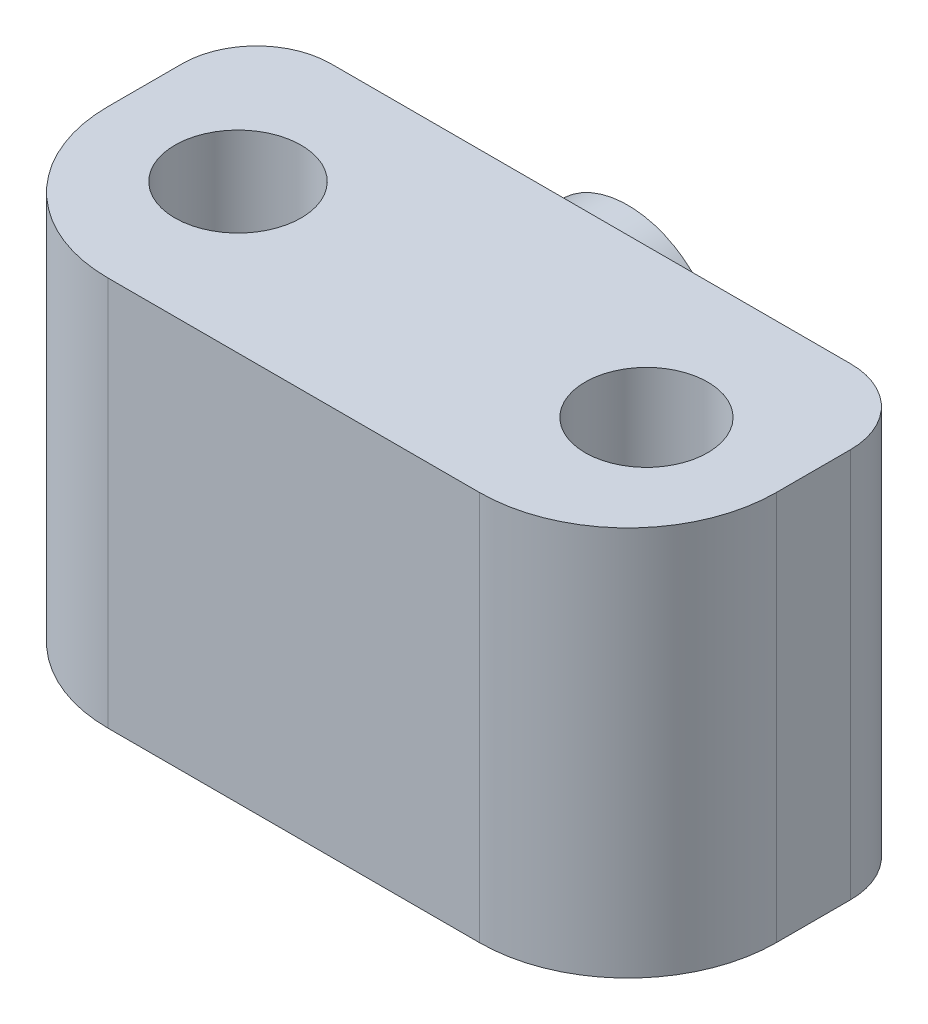
ISO-10303-21;
HEADER;
FILE_DESCRIPTION(('STEP AP214'),'2;1');
FILE_NAME('part.step','',(''),(''),'','','');
FILE_SCHEMA(('AUTOMOTIVE_DESIGN { 1 0 10303 214 1 1 1 1 }'));
ENDSEC;
DATA;
#1=APPLICATION_CONTEXT('core data for automotive mechanical design processes');
#2=APPLICATION_PROTOCOL_DEFINITION('international standard','automotive_design',2000,#1);
#3=PRODUCT_CONTEXT('',#1,'mechanical');
#4=PRODUCT('Part','Part','',(#3));
#5=PRODUCT_RELATED_PRODUCT_CATEGORY('part','',(#4));
#6=PRODUCT_DEFINITION_FORMATION('','',#4);
#7=PRODUCT_DEFINITION_CONTEXT('part definition',#1,'design');
#8=PRODUCT_DEFINITION('design','',#6,#7);
#9=PRODUCT_DEFINITION_SHAPE('','',#8);
#10=(LENGTH_UNIT() NAMED_UNIT(*) SI_UNIT(.MILLI.,.METRE.));
#11=(NAMED_UNIT(*) PLANE_ANGLE_UNIT() SI_UNIT($,.RADIAN.));
#12=(NAMED_UNIT(*) SI_UNIT($,.STERADIAN.) SOLID_ANGLE_UNIT());
#13=UNCERTAINTY_MEASURE_WITH_UNIT(LENGTH_MEASURE(1.E-05),#10,'distance_accuracy_value','');
#14=(GEOMETRIC_REPRESENTATION_CONTEXT(3) GLOBAL_UNCERTAINTY_ASSIGNED_CONTEXT((#13)) GLOBAL_UNIT_ASSIGNED_CONTEXT((#10,
#11,#12)) REPRESENTATION_CONTEXT('',''));
#15=CARTESIAN_POINT('',(0.,0.,0.));
#16=DIRECTION('',(0.,0.,1.));
#17=DIRECTION('',(1.,0.,0.));
#18=AXIS2_PLACEMENT_3D('',#15,#16,#17);
#19=CARTESIAN_POINT('',(-5.5,-18.75,4.));
#20=DIRECTION('',(0.,1.,0.));
#21=DIRECTION('',(0.,0.,1.));
#22=AXIS2_PLACEMENT_3D('',#19,#20,#21);
#23=CYLINDRICAL_SURFACE('',#22,1.25);
#24=CARTESIAN_POINT('',(-5.5,-6.25,4.));
#25=DIRECTION('',(0.,1.,0.));
#26=DIRECTION('',(0.,0.,1.));
#27=AXIS2_PLACEMENT_3D('',#24,#25,#26);
#28=CIRCLE('',#27,1.25);
#29=CARTESIAN_POINT('',(-5.5,-6.25,5.25));
#30=VERTEX_POINT('',#29);
#31=EDGE_CURVE('E181',#30,#30,#28,.T.);
#32=ORIENTED_EDGE('',*,*,#31,.F.);
#33=EDGE_LOOP('',(#32));
#34=FACE_BOUND('',#33,.T.);
#35=CARTESIAN_POINT('',(-5.5,-3.75,4.));
#36=DIRECTION('',(0.,1.,0.));
#37=DIRECTION('',(0.,0.,1.));
#38=AXIS2_PLACEMENT_3D('',#35,#36,#37);
#39=CIRCLE('',#38,1.25);
#40=CARTESIAN_POINT('',(-5.5,-3.75,5.25));
#41=VERTEX_POINT('',#40);
#42=EDGE_CURVE('E41',#41,#41,#39,.F.);
#43=ORIENTED_EDGE('',*,*,#42,.F.);
#44=EDGE_LOOP('',(#43));
#45=FACE_BOUND('',#44,.T.);
#46=ADVANCED_FACE('F37',(#34,#45),#23,.F.);
#47=CARTESIAN_POINT('',(5.5,-18.75,4.));
#48=DIRECTION('',(0.,1.,0.));
#49=DIRECTION('',(0.,0.,1.));
#50=AXIS2_PLACEMENT_3D('',#47,#48,#49);
#51=CYLINDRICAL_SURFACE('',#50,1.25);
#52=CARTESIAN_POINT('',(5.5,-6.25,4.));
#53=DIRECTION('',(0.,1.,0.));
#54=DIRECTION('',(0.,0.,1.));
#55=AXIS2_PLACEMENT_3D('',#52,#53,#54);
#56=CIRCLE('',#55,1.25);
#57=CARTESIAN_POINT('',(5.5,-6.25,5.25));
#58=VERTEX_POINT('',#57);
#59=EDGE_CURVE('E176',#58,#58,#56,.F.);
#60=ORIENTED_EDGE('',*,*,#59,.T.);
#61=EDGE_LOOP('',(#60));
#62=FACE_BOUND('',#61,.T.);
#63=CARTESIAN_POINT('',(5.5,-3.75,4.));
#64=DIRECTION('',(0.,1.,0.));
#65=DIRECTION('',(0.,0.,1.));
#66=AXIS2_PLACEMENT_3D('',#63,#64,#65);
#67=CIRCLE('',#66,1.25);
#68=CARTESIAN_POINT('',(5.5,-3.75,5.25));
#69=VERTEX_POINT('',#68);
#70=EDGE_CURVE('E147',#69,#69,#67,.T.);
#71=ORIENTED_EDGE('',*,*,#70,.T.);
#72=EDGE_LOOP('',(#71));
#73=FACE_BOUND('',#72,.T.);
#74=ADVANCED_FACE('F235',(#62,#73),#51,.F.);
#75=CARTESIAN_POINT('',(0.,0.,0.));
#76=DIRECTION('',(0.,0.,1.));
#77=DIRECTION('',(1.,0.,0.));
#78=AXIS2_PLACEMENT_3D('',#75,#76,#77);
#79=PLANE('',#78);
#80=CARTESIAN_POINT('',(0.,1.45,0.));
#81=DIRECTION('',(0.,0.,1.));
#82=DIRECTION('',(1.,0.,0.));
#83=AXIS2_PLACEMENT_3D('',#80,#81,#82);
#84=CIRCLE('',#83,2.5);
#85=CARTESIAN_POINT('',(2.5,1.45,0.));
#86=VERTEX_POINT('',#85);
#87=EDGE_CURVE('E198',#86,#86,#84,.F.);
#88=ORIENTED_EDGE('',*,*,#87,.F.);
#89=EDGE_LOOP('',(#88));
#90=FACE_BOUND('',#89,.T.);
#91=DIRECTION('',(-1.,0.,0.));
#92=VECTOR('',#91,1.);
#93=CARTESIAN_POINT('',(7.,4.25,0.));
#94=LINE('',#93,#92);
#95=CARTESIAN_POINT('',(7.,4.25,0.));
#96=VERTEX_POINT('',#95);
#97=CARTESIAN_POINT('',(-7.,4.25,0.));
#98=VERTEX_POINT('',#97);
#99=EDGE_CURVE('E54',#96,#98,#94,.T.);
#100=ORIENTED_EDGE('',*,*,#99,.F.);
#101=DIRECTION('',(0.,1.,0.));
#102=VECTOR('',#101,1.);
#103=CARTESIAN_POINT('',(7.,0.,0.));
#104=LINE('',#103,#102);
#105=CARTESIAN_POINT('',(7.,-6.25,0.));
#106=VERTEX_POINT('',#105);
#107=EDGE_CURVE('E143',#96,#106,#104,.F.);
#108=ORIENTED_EDGE('',*,*,#107,.T.);
#109=DIRECTION('',(1.,0.,0.));
#110=VECTOR('',#109,1.);
#111=CARTESIAN_POINT('',(-9.,-6.25,0.));
#112=LINE('',#111,#110);
#113=CARTESIAN_POINT('',(-7.,-6.25,0.));
#114=VERTEX_POINT('',#113);
#115=EDGE_CURVE('E187',#114,#106,#112,.T.);
#116=ORIENTED_EDGE('',*,*,#115,.F.);
#117=DIRECTION('',(0.,-1.,0.));
#118=VECTOR('',#117,1.);
#119=CARTESIAN_POINT('',(-7.,0.,0.));
#120=LINE('',#119,#118);
#121=EDGE_CURVE('E140',#114,#98,#120,.F.);
#122=ORIENTED_EDGE('',*,*,#121,.T.);
#123=EDGE_LOOP('',(#100,#108,#116,#122));
#124=FACE_BOUND('',#123,.T.);
#125=ADVANCED_FACE('F220',(#90,#124),#79,.F.);
#126=CARTESIAN_POINT('',(9.,6.25,8.));
#127=DIRECTION('',(-1.,0.,0.));
#128=DIRECTION('',(0.,0.,1.));
#129=AXIS2_PLACEMENT_3D('',#126,#127,#128);
#130=PLANE('',#129);
#131=DIRECTION('',(0.,0.,-1.));
#132=VECTOR('',#131,1.);
#133=CARTESIAN_POINT('',(9.,4.25,4.));
#134=LINE('',#133,#132);
#135=CARTESIAN_POINT('',(9.,4.25,4.));
#136=VERTEX_POINT('',#135);
#137=CARTESIAN_POINT('',(9.,4.25,2.));
#138=VERTEX_POINT('',#137);
#139=EDGE_CURVE('E105',#136,#138,#134,.T.);
#140=ORIENTED_EDGE('',*,*,#139,.F.);
#141=DIRECTION('',(0.,1.,0.));
#142=VECTOR('',#141,1.);
#143=CARTESIAN_POINT('',(9.,-6.25,4.));
#144=LINE('',#143,#142);
#145=CARTESIAN_POINT('',(9.,-6.25,4.));
#146=VERTEX_POINT('',#145);
#147=EDGE_CURVE('E118',#136,#146,#144,.F.);
#148=ORIENTED_EDGE('',*,*,#147,.T.);
#149=DIRECTION('',(0.,0.,-1.));
#150=VECTOR('',#149,1.);
#151=CARTESIAN_POINT('',(9.,-6.25,8.));
#152=LINE('',#151,#150);
#153=CARTESIAN_POINT('',(9.,-6.25,2.));
#154=VERTEX_POINT('',#153);
#155=EDGE_CURVE('E191',#146,#154,#152,.T.);
#156=ORIENTED_EDGE('',*,*,#155,.T.);
#157=DIRECTION('',(0.,1.,0.));
#158=VECTOR('',#157,1.);
#159=CARTESIAN_POINT('',(9.,6.25,2.));
#160=LINE('',#159,#158);
#161=EDGE_CURVE('E121',#154,#138,#160,.T.);
#162=ORIENTED_EDGE('',*,*,#161,.T.);
#163=EDGE_LOOP('',(#140,#148,#156,#162));
#164=FACE_BOUND('',#163,.T.);
#165=ADVANCED_FACE('F116',(#164),#130,.F.);
#166=CARTESIAN_POINT('',(-9.,6.25,8.));
#167=DIRECTION('',(1.,0.,0.));
#168=DIRECTION('',(0.,0.,-1.));
#169=AXIS2_PLACEMENT_3D('',#166,#167,#168);
#170=PLANE('',#169);
#171=DIRECTION('',(0.,0.,1.));
#172=VECTOR('',#171,1.);
#173=CARTESIAN_POINT('',(-9.,4.25,2.));
#174=LINE('',#173,#172);
#175=CARTESIAN_POINT('',(-9.,4.25,2.));
#176=VERTEX_POINT('',#175);
#177=CARTESIAN_POINT('',(-9.,4.25,4.));
#178=VERTEX_POINT('',#177);
#179=EDGE_CURVE('E171',#176,#178,#174,.T.);
#180=ORIENTED_EDGE('',*,*,#179,.F.);
#181=DIRECTION('',(0.,-1.,0.));
#182=VECTOR('',#181,1.);
#183=CARTESIAN_POINT('',(-9.,6.25,2.));
#184=LINE('',#183,#182);
#185=CARTESIAN_POINT('',(-9.,-6.25,2.));
#186=VERTEX_POINT('',#185);
#187=EDGE_CURVE('E11',#176,#186,#184,.T.);
#188=ORIENTED_EDGE('',*,*,#187,.T.);
#189=DIRECTION('',(0.,0.,-1.));
#190=VECTOR('',#189,1.);
#191=CARTESIAN_POINT('',(-9.,-6.25,8.));
#192=LINE('',#191,#190);
#193=CARTESIAN_POINT('',(-9.,-6.25,4.));
#194=VERTEX_POINT('',#193);
#195=EDGE_CURVE('E195',#194,#186,#192,.T.);
#196=ORIENTED_EDGE('',*,*,#195,.F.);
#197=DIRECTION('',(0.,-1.,0.));
#198=VECTOR('',#197,1.);
#199=CARTESIAN_POINT('',(-9.,6.25,4.));
#200=LINE('',#199,#198);
#201=EDGE_CURVE('E136',#194,#178,#200,.F.);
#202=ORIENTED_EDGE('',*,*,#201,.T.);
#203=EDGE_LOOP('',(#180,#188,#196,#202));
#204=FACE_BOUND('',#203,.T.);
#205=ADVANCED_FACE('F224',(#204),#170,.F.);
#206=CARTESIAN_POINT('',(0.,0.,8.));
#207=DIRECTION('',(0.,0.,1.));
#208=DIRECTION('',(1.,0.,0.));
#209=AXIS2_PLACEMENT_3D('',#206,#207,#208);
#210=PLANE('',#209);
#211=DIRECTION('',(0.,1.,0.));
#212=VECTOR('',#211,1.);
#213=CARTESIAN_POINT('',(5.,6.25,8.));
#214=LINE('',#213,#212);
#215=CARTESIAN_POINT('',(5.,-6.25,8.));
#216=VERTEX_POINT('',#215);
#217=CARTESIAN_POINT('',(5.,4.25,8.));
#218=VERTEX_POINT('',#217);
#219=EDGE_CURVE('E128',#216,#218,#214,.T.);
#220=ORIENTED_EDGE('',*,*,#219,.T.);
#221=DIRECTION('',(1.,0.,0.));
#222=VECTOR('',#221,1.);
#223=CARTESIAN_POINT('',(-5.,4.25,8.));
#224=LINE('',#223,#222);
#225=CARTESIAN_POINT('',(-5.,4.25,8.));
#226=VERTEX_POINT('',#225);
#227=EDGE_CURVE('E108',#226,#218,#224,.T.);
#228=ORIENTED_EDGE('',*,*,#227,.F.);
#229=DIRECTION('',(0.,-1.,0.));
#230=VECTOR('',#229,1.);
#231=CARTESIAN_POINT('',(-5.,-6.25,8.));
#232=LINE('',#231,#230);
#233=CARTESIAN_POINT('',(-5.,-6.25,8.));
#234=VERTEX_POINT('',#233);
#235=EDGE_CURVE('E131',#226,#234,#232,.T.);
#236=ORIENTED_EDGE('',*,*,#235,.T.);
#237=DIRECTION('',(1.,0.,0.));
#238=VECTOR('',#237,1.);
#239=CARTESIAN_POINT('',(-9.,-6.25,8.));
#240=LINE('',#239,#238);
#241=EDGE_CURVE('E188',#234,#216,#240,.T.);
#242=ORIENTED_EDGE('',*,*,#241,.T.);
#243=EDGE_LOOP('',(#220,#228,#236,#242));
#244=FACE_BOUND('',#243,.T.);
#245=ADVANCED_FACE('F207',(#244),#210,.T.);
#246=CARTESIAN_POINT('',(5.,0.,4.));
#247=DIRECTION('',(0.,-1.,0.));
#248=DIRECTION('',(0.,0.,-1.));
#249=AXIS2_PLACEMENT_3D('',#246,#247,#248);
#250=CYLINDRICAL_SURFACE('',#249,4.);
#251=ORIENTED_EDGE('',*,*,#147,.F.);
#252=CARTESIAN_POINT('',(5.,4.25,4.));
#253=DIRECTION('',(0.,1.,0.));
#254=DIRECTION('',(0.,0.,1.));
#255=AXIS2_PLACEMENT_3D('',#252,#253,#254);
#256=CIRCLE('',#255,4.);
#257=EDGE_CURVE('E102',#218,#136,#256,.T.);
#258=ORIENTED_EDGE('',*,*,#257,.F.);
#259=ORIENTED_EDGE('',*,*,#219,.F.);
#260=CARTESIAN_POINT('',(5.,-6.25,4.));
#261=DIRECTION('',(0.,1.,0.));
#262=DIRECTION('',(0.,0.,1.));
#263=AXIS2_PLACEMENT_3D('',#260,#261,#262);
#264=CIRCLE('',#263,4.);
#265=EDGE_CURVE('E126',#146,#216,#264,.F.);
#266=ORIENTED_EDGE('',*,*,#265,.F.);
#267=EDGE_LOOP('',(#251,#258,#259,#266));
#268=FACE_BOUND('',#267,.T.);
#269=ADVANCED_FACE('F125',(#268),#250,.T.);
#270=CARTESIAN_POINT('',(-5.,0.,4.));
#271=DIRECTION('',(0.,1.,0.));
#272=DIRECTION('',(0.,0.,1.));
#273=AXIS2_PLACEMENT_3D('',#270,#271,#272);
#274=CYLINDRICAL_SURFACE('',#273,4.);
#275=ORIENTED_EDGE('',*,*,#235,.F.);
#276=CARTESIAN_POINT('',(-5.,4.25,4.));
#277=DIRECTION('',(0.,1.,0.));
#278=DIRECTION('',(0.,0.,1.));
#279=AXIS2_PLACEMENT_3D('',#276,#277,#278);
#280=CIRCLE('',#279,4.);
#281=EDGE_CURVE('E173',#178,#226,#280,.T.);
#282=ORIENTED_EDGE('',*,*,#281,.F.);
#283=ORIENTED_EDGE('',*,*,#201,.F.);
#284=CARTESIAN_POINT('',(-5.,-6.25,4.));
#285=DIRECTION('',(0.,1.,0.));
#286=DIRECTION('',(0.,0.,1.));
#287=AXIS2_PLACEMENT_3D('',#284,#285,#286);
#288=CIRCLE('',#287,4.);
#289=EDGE_CURVE('E127',#234,#194,#288,.F.);
#290=ORIENTED_EDGE('',*,*,#289,.F.);
#291=EDGE_LOOP('',(#275,#282,#283,#290));
#292=FACE_BOUND('',#291,.T.);
#293=ADVANCED_FACE('F212',(#292),#274,.T.);
#294=CARTESIAN_POINT('',(7.,6.25,2.));
#295=DIRECTION('',(0.,1.,0.));
#296=DIRECTION('',(0.,0.,1.));
#297=AXIS2_PLACEMENT_3D('',#294,#295,#296);
#298=CYLINDRICAL_SURFACE('',#297,2.);
#299=ORIENTED_EDGE('',*,*,#107,.F.);
#300=CARTESIAN_POINT('',(7.,4.25,2.));
#301=DIRECTION('',(0.,1.,0.));
#302=DIRECTION('',(0.,0.,1.));
#303=AXIS2_PLACEMENT_3D('',#300,#301,#302);
#304=CIRCLE('',#303,2.);
#305=EDGE_CURVE('E122',#138,#96,#304,.T.);
#306=ORIENTED_EDGE('',*,*,#305,.F.);
#307=ORIENTED_EDGE('',*,*,#161,.F.);
#308=CARTESIAN_POINT('',(7.,-6.25,2.));
#309=DIRECTION('',(0.,1.,0.));
#310=DIRECTION('',(0.,0.,1.));
#311=AXIS2_PLACEMENT_3D('',#308,#309,#310);
#312=CIRCLE('',#311,2.);
#313=EDGE_CURVE('E46',#106,#154,#312,.F.);
#314=ORIENTED_EDGE('',*,*,#313,.F.);
#315=EDGE_LOOP('',(#299,#306,#307,#314));
#316=FACE_BOUND('',#315,.T.);
#317=ADVANCED_FACE('F218',(#316),#298,.T.);
#318=CARTESIAN_POINT('',(-7.,6.25,2.));
#319=DIRECTION('',(0.,-1.,0.));
#320=DIRECTION('',(0.,0.,-1.));
#321=AXIS2_PLACEMENT_3D('',#318,#319,#320);
#322=CYLINDRICAL_SURFACE('',#321,2.);
#323=ORIENTED_EDGE('',*,*,#187,.F.);
#324=CARTESIAN_POINT('',(-7.,4.25,2.));
#325=DIRECTION('',(0.,1.,0.));
#326=DIRECTION('',(0.,0.,1.));
#327=AXIS2_PLACEMENT_3D('',#324,#325,#326);
#328=CIRCLE('',#327,2.);
#329=EDGE_CURVE('E169',#98,#176,#328,.T.);
#330=ORIENTED_EDGE('',*,*,#329,.F.);
#331=ORIENTED_EDGE('',*,*,#121,.F.);
#332=CARTESIAN_POINT('',(-7.,-6.25,2.));
#333=DIRECTION('',(0.,1.,0.));
#334=DIRECTION('',(0.,0.,1.));
#335=AXIS2_PLACEMENT_3D('',#332,#333,#334);
#336=CIRCLE('',#335,2.);
#337=EDGE_CURVE('E145',#186,#114,#336,.F.);
#338=ORIENTED_EDGE('',*,*,#337,.F.);
#339=EDGE_LOOP('',(#323,#330,#331,#338));
#340=FACE_BOUND('',#339,.T.);
#341=ADVANCED_FACE('F39',(#340),#322,.T.);
#342=CARTESIAN_POINT('',(-9.,-6.25,8.));
#343=DIRECTION('',(0.,1.,0.));
#344=DIRECTION('',(0.,0.,1.));
#345=AXIS2_PLACEMENT_3D('',#342,#343,#344);
#346=PLANE('',#345);
#347=ORIENTED_EDGE('',*,*,#59,.F.);
#348=EDGE_LOOP('',(#347));
#349=FACE_BOUND('',#348,.T.);
#350=ORIENTED_EDGE('',*,*,#31,.T.);
#351=EDGE_LOOP('',(#350));
#352=FACE_BOUND('',#351,.T.);
#353=ORIENTED_EDGE('',*,*,#115,.T.);
#354=ORIENTED_EDGE('',*,*,#313,.T.);
#355=ORIENTED_EDGE('',*,*,#155,.F.);
#356=ORIENTED_EDGE('',*,*,#265,.T.);
#357=ORIENTED_EDGE('',*,*,#241,.F.);
#358=ORIENTED_EDGE('',*,*,#289,.T.);
#359=ORIENTED_EDGE('',*,*,#195,.T.);
#360=ORIENTED_EDGE('',*,*,#337,.T.);
#361=EDGE_LOOP('',(#353,#354,#355,#356,#357,#358,#359,#360));
#362=FACE_BOUND('',#361,.T.);
#363=ADVANCED_FACE('F214',(#349,#352,#362),#346,.F.);
#364=CARTESIAN_POINT('',(0.,1.45,-1.));
#365=DIRECTION('',(0.,0.,-1.));
#366=DIRECTION('',(-1.,0.,0.));
#367=AXIS2_PLACEMENT_3D('',#364,#365,#366);
#368=PLANE('',#367);
#369=CARTESIAN_POINT('',(0.,1.45,-1.));
#370=DIRECTION('',(0.,0.,-1.));
#371=DIRECTION('',(-1.,0.,0.));
#372=AXIS2_PLACEMENT_3D('',#369,#370,#371);
#373=CIRCLE('',#372,2.5);
#374=CARTESIAN_POINT('',(-2.5,1.45,-1.));
#375=VERTEX_POINT('',#374);
#376=EDGE_CURVE('E180',#375,#375,#373,.T.);
#377=ORIENTED_EDGE('',*,*,#376,.T.);
#378=EDGE_LOOP('',(#377));
#379=FACE_BOUND('',#378,.T.);
#380=CARTESIAN_POINT('',(0.,1.45,-1.));
#381=DIRECTION('',(0.,0.,-1.));
#382=DIRECTION('',(-1.,0.,0.));
#383=AXIS2_PLACEMENT_3D('',#380,#381,#382);
#384=CIRCLE('',#383,1.625);
#385=CARTESIAN_POINT('',(-1.625,1.45,-1.));
#386=VERTEX_POINT('',#385);
#387=EDGE_CURVE('E177',#386,#386,#384,.T.);
#388=ORIENTED_EDGE('',*,*,#387,.F.);
#389=EDGE_LOOP('',(#388));
#390=FACE_BOUND('',#389,.T.);
#391=ADVANCED_FACE('F247',(#379,#390),#368,.T.);
#392=CARTESIAN_POINT('',(0.,1.45,-1.));
#393=DIRECTION('',(0.,0.,1.));
#394=DIRECTION('',(1.,0.,0.));
#395=AXIS2_PLACEMENT_3D('',#392,#393,#394);
#396=CYLINDRICAL_SURFACE('',#395,2.5);
#397=ORIENTED_EDGE('',*,*,#376,.F.);
#398=EDGE_LOOP('',(#397));
#399=FACE_BOUND('',#398,.T.);
#400=ORIENTED_EDGE('',*,*,#87,.T.);
#401=EDGE_LOOP('',(#400));
#402=FACE_BOUND('',#401,.T.);
#403=ADVANCED_FACE('F250',(#399,#402),#396,.T.);
#404=CARTESIAN_POINT('',(0.,1.45,2.5));
#405=DIRECTION('',(0.,0.,-1.));
#406=DIRECTION('',(-1.,0.,0.));
#407=AXIS2_PLACEMENT_3D('',#404,#405,#406);
#408=PLANE('',#407);
#409=CARTESIAN_POINT('',(0.,1.45,2.5));
#410=DIRECTION('',(0.,0.,-1.));
#411=DIRECTION('',(-1.,0.,0.));
#412=AXIS2_PLACEMENT_3D('',#409,#410,#411);
#413=CIRCLE('',#412,1.625);
#414=CARTESIAN_POINT('',(-1.625,1.45,2.5));
#415=VERTEX_POINT('',#414);
#416=EDGE_CURVE('E184',#415,#415,#413,.T.);
#417=ORIENTED_EDGE('',*,*,#416,.T.);
#418=EDGE_LOOP('',(#417));
#419=FACE_BOUND('',#418,.T.);
#420=ADVANCED_FACE('F254',(#419),#408,.T.);
#421=CARTESIAN_POINT('',(0.,1.45,2.5));
#422=DIRECTION('',(0.,0.,-1.));
#423=DIRECTION('',(-1.,0.,0.));
#424=AXIS2_PLACEMENT_3D('',#421,#422,#423);
#425=CYLINDRICAL_SURFACE('',#424,1.625);
#426=ORIENTED_EDGE('',*,*,#416,.F.);
#427=EDGE_LOOP('',(#426));
#428=FACE_BOUND('',#427,.T.);
#429=ORIENTED_EDGE('',*,*,#387,.T.);
#430=EDGE_LOOP('',(#429));
#431=FACE_BOUND('',#430,.T.);
#432=ADVANCED_FACE('F258',(#428,#431),#425,.F.);
#433=CARTESIAN_POINT('',(5.,4.25,4.));
#434=DIRECTION('',(0.,1.,0.));
#435=DIRECTION('',(0.,0.,1.));
#436=AXIS2_PLACEMENT_3D('',#433,#434,#435);
#437=PLANE('',#436);
#438=CARTESIAN_POINT('',(5.5,4.25,4.));
#439=DIRECTION('',(0.,1.,0.));
#440=DIRECTION('',(0.,0.,1.));
#441=AXIS2_PLACEMENT_3D('',#438,#439,#440);
#442=CIRCLE('',#441,1.65);
#443=CARTESIAN_POINT('',(5.5,4.25,5.65));
#444=VERTEX_POINT('',#443);
#445=EDGE_CURVE('E154',#444,#444,#442,.T.);
#446=ORIENTED_EDGE('',*,*,#445,.F.);
#447=EDGE_LOOP('',(#446));
#448=FACE_BOUND('',#447,.T.);
#449=CARTESIAN_POINT('',(-5.5,4.25,4.));
#450=DIRECTION('',(0.,1.,0.));
#451=DIRECTION('',(0.,0.,1.));
#452=AXIS2_PLACEMENT_3D('',#449,#450,#451);
#453=CIRCLE('',#452,1.7);
#454=CARTESIAN_POINT('',(-5.5,4.25,5.7));
#455=VERTEX_POINT('',#454);
#456=EDGE_CURVE('E164',#455,#455,#453,.T.);
#457=ORIENTED_EDGE('',*,*,#456,.F.);
#458=EDGE_LOOP('',(#457));
#459=FACE_BOUND('',#458,.T.);
#460=ORIENTED_EDGE('',*,*,#257,.T.);
#461=ORIENTED_EDGE('',*,*,#139,.T.);
#462=ORIENTED_EDGE('',*,*,#305,.T.);
#463=ORIENTED_EDGE('',*,*,#99,.T.);
#464=ORIENTED_EDGE('',*,*,#329,.T.);
#465=ORIENTED_EDGE('',*,*,#179,.T.);
#466=ORIENTED_EDGE('',*,*,#281,.T.);
#467=ORIENTED_EDGE('',*,*,#227,.T.);
#468=EDGE_LOOP('',(#460,#461,#462,#463,#464,#465,#466,#467));
#469=FACE_BOUND('',#468,.T.);
#470=ADVANCED_FACE('F104',(#448,#459,#469),#437,.T.);
#471=CARTESIAN_POINT('',(-5.5,-3.75,4.));
#472=DIRECTION('',(0.,1.,0.));
#473=DIRECTION('',(0.,0.,1.));
#474=AXIS2_PLACEMENT_3D('',#471,#472,#473);
#475=PLANE('',#474);
#476=CARTESIAN_POINT('',(-5.5,-3.75,4.));
#477=DIRECTION('',(0.,1.,0.));
#478=DIRECTION('',(0.,0.,1.));
#479=AXIS2_PLACEMENT_3D('',#476,#477,#478);
#480=CIRCLE('',#479,1.7);
#481=CARTESIAN_POINT('',(-5.5,-3.75,5.7));
#482=VERTEX_POINT('',#481);
#483=EDGE_CURVE('E159',#482,#482,#480,.T.);
#484=ORIENTED_EDGE('',*,*,#483,.T.);
#485=EDGE_LOOP('',(#484));
#486=FACE_BOUND('',#485,.T.);
#487=ORIENTED_EDGE('',*,*,#42,.T.);
#488=EDGE_LOOP('',(#487));
#489=FACE_BOUND('',#488,.T.);
#490=ADVANCED_FACE('F318',(#486,#489),#475,.T.);
#491=CARTESIAN_POINT('',(-5.5,-3.75,4.));
#492=DIRECTION('',(0.,1.,0.));
#493=DIRECTION('',(0.,0.,1.));
#494=AXIS2_PLACEMENT_3D('',#491,#492,#493);
#495=CYLINDRICAL_SURFACE('',#494,1.7);
#496=ORIENTED_EDGE('',*,*,#483,.F.);
#497=EDGE_LOOP('',(#496));
#498=FACE_BOUND('',#497,.T.);
#499=ORIENTED_EDGE('',*,*,#456,.T.);
#500=EDGE_LOOP('',(#499));
#501=FACE_BOUND('',#500,.T.);
#502=ADVANCED_FACE('F327',(#498,#501),#495,.F.);
#503=CARTESIAN_POINT('',(5.5,-3.75,4.));
#504=DIRECTION('',(0.,1.,0.));
#505=DIRECTION('',(0.,0.,1.));
#506=AXIS2_PLACEMENT_3D('',#503,#504,#505);
#507=CYLINDRICAL_SURFACE('',#506,1.65);
#508=CARTESIAN_POINT('',(5.5,-3.75,4.));
#509=DIRECTION('',(0.,1.,0.));
#510=DIRECTION('',(0.,0.,1.));
#511=AXIS2_PLACEMENT_3D('',#508,#509,#510);
#512=CIRCLE('',#511,1.65);
#513=CARTESIAN_POINT('',(5.5,-3.75,5.65));
#514=VERTEX_POINT('',#513);
#515=EDGE_CURVE('E149',#514,#514,#512,.T.);
#516=ORIENTED_EDGE('',*,*,#515,.F.);
#517=EDGE_LOOP('',(#516));
#518=FACE_BOUND('',#517,.T.);
#519=ORIENTED_EDGE('',*,*,#445,.T.);
#520=EDGE_LOOP('',(#519));
#521=FACE_BOUND('',#520,.T.);
#522=ADVANCED_FACE('F337',(#518,#521),#507,.F.);
#523=CARTESIAN_POINT('',(5.5,-3.75,4.));
#524=DIRECTION('',(0.,1.,0.));
#525=DIRECTION('',(0.,0.,1.));
#526=AXIS2_PLACEMENT_3D('',#523,#524,#525);
#527=PLANE('',#526);
#528=ORIENTED_EDGE('',*,*,#70,.F.);
#529=EDGE_LOOP('',(#528));
#530=FACE_BOUND('',#529,.T.);
#531=ORIENTED_EDGE('',*,*,#515,.T.);
#532=EDGE_LOOP('',(#531));
#533=FACE_BOUND('',#532,.T.);
#534=ADVANCED_FACE('F347',(#530,#533),#527,.T.);
#535=CLOSED_SHELL('',(#46,#74,#125,#165,#205,#245,#269,#293,#317,#341,#363,#391,#403,#420,#432,
#470,#490,#502,#522,#534));
#536=MANIFOLD_SOLID_BREP('B2',#535);
#537=ADVANCED_BREP_SHAPE_REPRESENTATION('',(#18,#536),#14);
#538=SHAPE_DEFINITION_REPRESENTATION(#9,#537);
ENDSEC;
END-ISO-10303-21;
